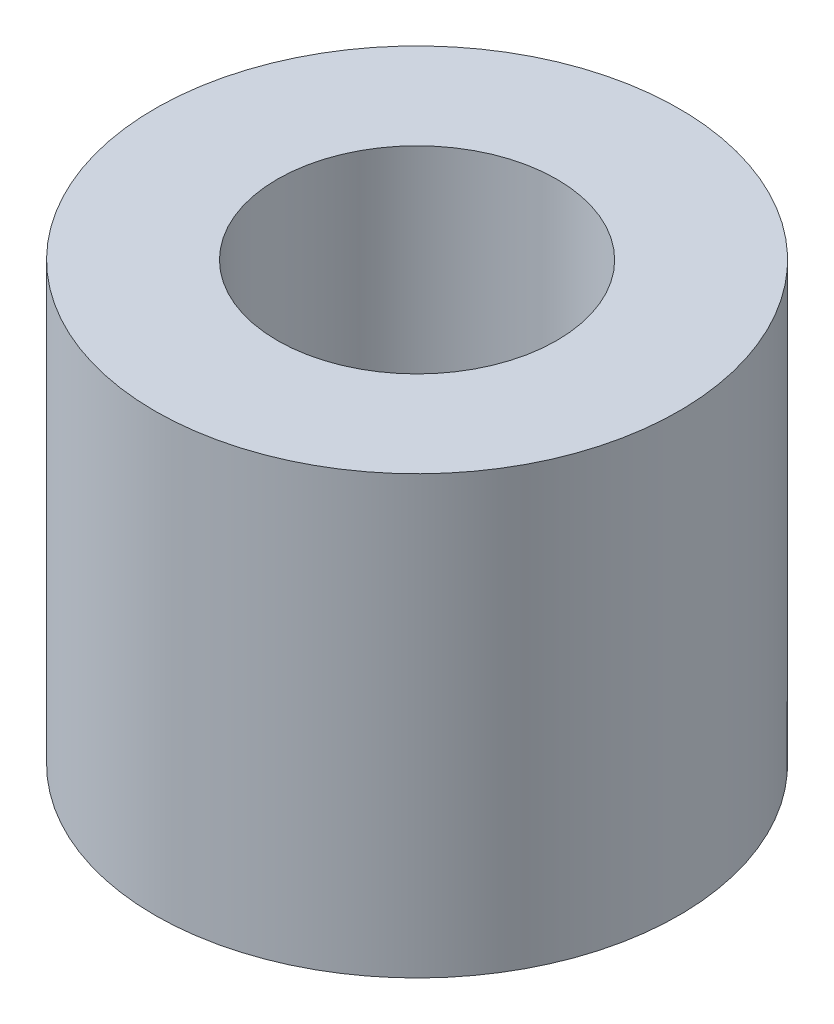
ISO-10303-21;
HEADER;
FILE_DESCRIPTION(('STEP AP214'),'2;1');
FILE_NAME('part.step','',(''),(''),'','','');
FILE_SCHEMA(('AUTOMOTIVE_DESIGN { 1 0 10303 214 1 1 1 1 }'));
ENDSEC;
DATA;
#1=APPLICATION_CONTEXT('core data for automotive mechanical design processes');
#2=APPLICATION_PROTOCOL_DEFINITION('international standard','automotive_design',2000,#1);
#3=PRODUCT_CONTEXT('',#1,'mechanical');
#4=PRODUCT('Part','Part','',(#3));
#5=PRODUCT_RELATED_PRODUCT_CATEGORY('part','',(#4));
#6=PRODUCT_DEFINITION_FORMATION('','',#4);
#7=PRODUCT_DEFINITION_CONTEXT('part definition',#1,'design');
#8=PRODUCT_DEFINITION('design','',#6,#7);
#9=PRODUCT_DEFINITION_SHAPE('','',#8);
#10=(LENGTH_UNIT() NAMED_UNIT(*) SI_UNIT(.MILLI.,.METRE.));
#11=(NAMED_UNIT(*) PLANE_ANGLE_UNIT() SI_UNIT($,.RADIAN.));
#12=(NAMED_UNIT(*) SI_UNIT($,.STERADIAN.) SOLID_ANGLE_UNIT());
#13=UNCERTAINTY_MEASURE_WITH_UNIT(LENGTH_MEASURE(1.E-05),#10,'distance_accuracy_value','');
#14=(GEOMETRIC_REPRESENTATION_CONTEXT(3) GLOBAL_UNCERTAINTY_ASSIGNED_CONTEXT((#13)) GLOBAL_UNIT_ASSIGNED_CONTEXT((#10,
#11,#12)) REPRESENTATION_CONTEXT('',''));
#15=CARTESIAN_POINT('',(0.,0.,0.));
#16=DIRECTION('',(0.,0.,1.));
#17=DIRECTION('',(1.,0.,0.));
#18=AXIS2_PLACEMENT_3D('',#15,#16,#17);
#19=CARTESIAN_POINT('',(0.,5.,0.));
#20=DIRECTION('',(0.,1.,0.));
#21=DIRECTION('',(0.,0.,1.));
#22=AXIS2_PLACEMENT_3D('',#19,#20,#21);
#23=PLANE('',#22);
#24=CARTESIAN_POINT('',(0.,5.,0.));
#25=DIRECTION('',(0.,1.,0.));
#26=DIRECTION('',(0.,0.,1.));
#27=AXIS2_PLACEMENT_3D('',#24,#25,#26);
#28=CIRCLE('',#27,3.);
#29=CARTESIAN_POINT('',(0.,5.,3.));
#30=VERTEX_POINT('',#29);
#31=EDGE_CURVE('E10',#30,#30,#28,.T.);
#32=ORIENTED_EDGE('',*,*,#31,.T.);
#33=EDGE_LOOP('',(#32));
#34=FACE_BOUND('',#33,.T.);
#35=CARTESIAN_POINT('',(0.,5.,0.));
#36=DIRECTION('',(0.,1.,0.));
#37=DIRECTION('',(0.,0.,1.));
#38=AXIS2_PLACEMENT_3D('',#35,#36,#37);
#39=CIRCLE('',#38,1.6);
#40=CARTESIAN_POINT('',(0.,5.,1.6));
#41=VERTEX_POINT('',#40);
#42=EDGE_CURVE('E42',#41,#41,#39,.T.);
#43=ORIENTED_EDGE('',*,*,#42,.F.);
#44=EDGE_LOOP('',(#43));
#45=FACE_BOUND('',#44,.T.);
#46=ADVANCED_FACE('F31',(#34,#45),#23,.T.);
#47=CARTESIAN_POINT('',(0.,0.,0.));
#48=DIRECTION('',(0.,1.,0.));
#49=DIRECTION('',(0.,0.,1.));
#50=AXIS2_PLACEMENT_3D('',#47,#48,#49);
#51=PLANE('',#50);
#52=CARTESIAN_POINT('',(0.,0.,0.));
#53=DIRECTION('',(0.,1.,0.));
#54=DIRECTION('',(0.,0.,1.));
#55=AXIS2_PLACEMENT_3D('',#52,#53,#54);
#56=CIRCLE('',#55,3.);
#57=CARTESIAN_POINT('',(0.,0.,3.));
#58=VERTEX_POINT('',#57);
#59=EDGE_CURVE('E35',#58,#58,#56,.T.);
#60=ORIENTED_EDGE('',*,*,#59,.F.);
#61=EDGE_LOOP('',(#60));
#62=FACE_BOUND('',#61,.T.);
#63=CARTESIAN_POINT('',(0.,0.,0.));
#64=DIRECTION('',(0.,1.,0.));
#65=DIRECTION('',(0.,0.,1.));
#66=AXIS2_PLACEMENT_3D('',#63,#64,#65);
#67=CIRCLE('',#66,1.6);
#68=CARTESIAN_POINT('',(0.,0.,1.6));
#69=VERTEX_POINT('',#68);
#70=EDGE_CURVE('E44',#69,#69,#67,.T.);
#71=ORIENTED_EDGE('',*,*,#70,.T.);
#72=EDGE_LOOP('',(#71));
#73=FACE_BOUND('',#72,.T.);
#74=ADVANCED_FACE('F54',(#62,#73),#51,.F.);
#75=CARTESIAN_POINT('',(0.,5.,0.));
#76=DIRECTION('',(0.,-1.,0.));
#77=DIRECTION('',(0.,0.,-1.));
#78=AXIS2_PLACEMENT_3D('',#75,#76,#77);
#79=CYLINDRICAL_SURFACE('',#78,3.);
#80=ORIENTED_EDGE('',*,*,#31,.F.);
#81=EDGE_LOOP('',(#80));
#82=FACE_BOUND('',#81,.T.);
#83=ORIENTED_EDGE('',*,*,#59,.T.);
#84=EDGE_LOOP('',(#83));
#85=FACE_BOUND('',#84,.T.);
#86=ADVANCED_FACE('F33',(#82,#85),#79,.T.);
#87=CARTESIAN_POINT('',(0.,5.,0.));
#88=DIRECTION('',(0.,-1.,0.));
#89=DIRECTION('',(0.,0.,-1.));
#90=AXIS2_PLACEMENT_3D('',#87,#88,#89);
#91=CYLINDRICAL_SURFACE('',#90,1.6);
#92=ORIENTED_EDGE('',*,*,#42,.T.);
#93=EDGE_LOOP('',(#92));
#94=FACE_BOUND('',#93,.T.);
#95=ORIENTED_EDGE('',*,*,#70,.F.);
#96=EDGE_LOOP('',(#95));
#97=FACE_BOUND('',#96,.T.);
#98=ADVANCED_FACE('F50',(#94,#97),#91,.F.);
#99=CLOSED_SHELL('',(#46,#74,#86,#98));
#100=MANIFOLD_SOLID_BREP('B2',#99);
#101=ADVANCED_BREP_SHAPE_REPRESENTATION('',(#18,#100),#14);
#102=SHAPE_DEFINITION_REPRESENTATION(#9,#101);
ENDSEC;
END-ISO-10303-21;
